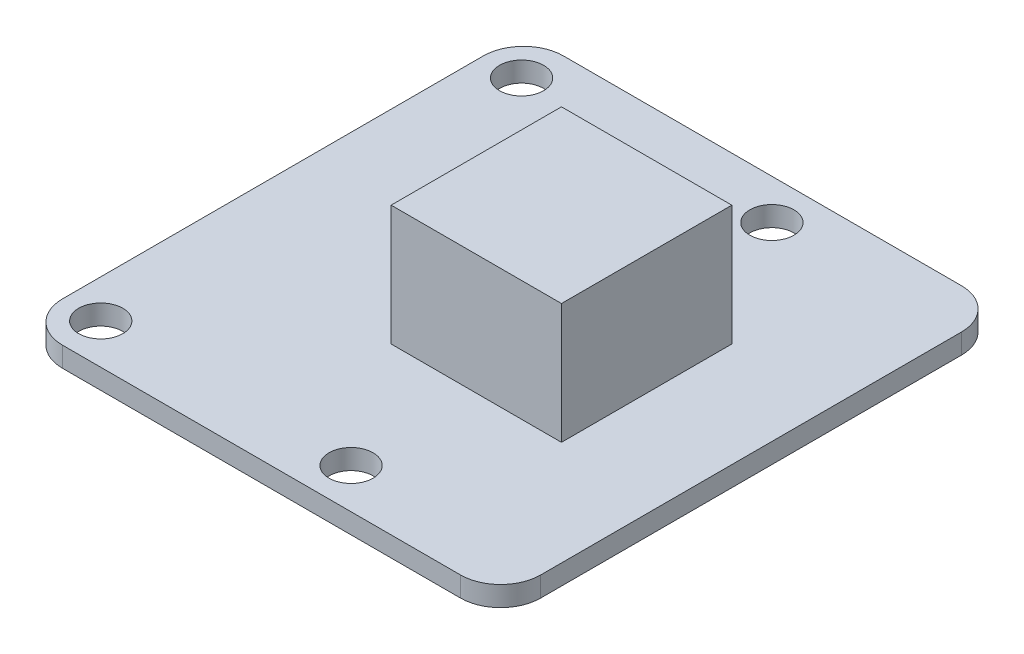
ISO-10303-21;
HEADER;
FILE_DESCRIPTION(('STEP AP214'),'2;1');
FILE_NAME('part.step','',(''),(''),'','','');
FILE_SCHEMA(('AUTOMOTIVE_DESIGN { 1 0 10303 214 1 1 1 1 }'));
ENDSEC;
DATA;
#1=APPLICATION_CONTEXT('core data for automotive mechanical design processes');
#2=APPLICATION_PROTOCOL_DEFINITION('international standard','automotive_design',2000,#1);
#3=PRODUCT_CONTEXT('',#1,'mechanical');
#4=PRODUCT('Part','Part','',(#3));
#5=PRODUCT_RELATED_PRODUCT_CATEGORY('part','',(#4));
#6=PRODUCT_DEFINITION_FORMATION('','',#4);
#7=PRODUCT_DEFINITION_CONTEXT('part definition',#1,'design');
#8=PRODUCT_DEFINITION('design','',#6,#7);
#9=PRODUCT_DEFINITION_SHAPE('','',#8);
#10=(LENGTH_UNIT() NAMED_UNIT(*) SI_UNIT(.MILLI.,.METRE.));
#11=(NAMED_UNIT(*) PLANE_ANGLE_UNIT() SI_UNIT($,.RADIAN.));
#12=(NAMED_UNIT(*) SI_UNIT($,.STERADIAN.) SOLID_ANGLE_UNIT());
#13=UNCERTAINTY_MEASURE_WITH_UNIT(LENGTH_MEASURE(1.E-05),#10,'distance_accuracy_value','');
#14=(GEOMETRIC_REPRESENTATION_CONTEXT(3) GLOBAL_UNCERTAINTY_ASSIGNED_CONTEXT((#13)) GLOBAL_UNIT_ASSIGNED_CONTEXT((#10,
#11,#12)) REPRESENTATION_CONTEXT('',''));
#15=CARTESIAN_POINT('',(0.,0.,0.));
#16=DIRECTION('',(0.,0.,1.));
#17=DIRECTION('',(1.,0.,0.));
#18=AXIS2_PLACEMENT_3D('',#15,#16,#17);
#19=CARTESIAN_POINT('',(0.,1.,0.));
#20=DIRECTION('',(0.,-1.,0.));
#21=DIRECTION('',(0.,0.,-1.));
#22=AXIS2_PLACEMENT_3D('',#19,#20,#21);
#23=PLANE('',#22);
#24=CARTESIAN_POINT('',(-10.02204,1.,10.5));
#25=DIRECTION('',(0.,1.,0.));
#26=DIRECTION('',(0.,0.,-1.));
#27=AXIS2_PLACEMENT_3D('',#24,#25,#26);
#28=CIRCLE('',#27,1.1);
#29=CARTESIAN_POINT('',(-10.02204,1.,9.4));
#30=VERTEX_POINT('',#29);
#31=EDGE_CURVE('E156',#30,#30,#28,.T.);
#32=ORIENTED_EDGE('',*,*,#31,.F.);
#33=EDGE_LOOP('',(#32));
#34=FACE_BOUND('',#33,.T.);
#35=CARTESIAN_POINT('',(2.469,1.,10.5));
#36=DIRECTION('',(0.,1.,0.));
#37=DIRECTION('',(0.,0.,-1.));
#38=AXIS2_PLACEMENT_3D('',#35,#36,#37);
#39=CIRCLE('',#38,1.1);
#40=CARTESIAN_POINT('',(2.469,1.,9.4));
#41=VERTEX_POINT('',#40);
#42=EDGE_CURVE('E166',#41,#41,#39,.T.);
#43=ORIENTED_EDGE('',*,*,#42,.F.);
#44=EDGE_LOOP('',(#43));
#45=FACE_BOUND('',#44,.T.);
#46=CARTESIAN_POINT('',(2.469,1.,-10.5));
#47=DIRECTION('',(0.,1.,0.));
#48=DIRECTION('',(0.,0.,1.));
#49=AXIS2_PLACEMENT_3D('',#46,#47,#48);
#50=CIRCLE('',#49,1.1);
#51=CARTESIAN_POINT('',(2.469,1.,-9.4));
#52=VERTEX_POINT('',#51);
#53=EDGE_CURVE('E174',#52,#52,#50,.T.);
#54=ORIENTED_EDGE('',*,*,#53,.F.);
#55=EDGE_LOOP('',(#54));
#56=FACE_BOUND('',#55,.T.);
#57=CARTESIAN_POINT('',(-10.02204,1.,-10.5));
#58=DIRECTION('',(0.,1.,0.));
#59=DIRECTION('',(0.,0.,1.));
#60=AXIS2_PLACEMENT_3D('',#57,#58,#59);
#61=CIRCLE('',#60,1.1);
#62=CARTESIAN_POINT('',(-10.02204,1.,-9.4));
#63=VERTEX_POINT('',#62);
#64=EDGE_CURVE('E182',#63,#63,#61,.T.);
#65=ORIENTED_EDGE('',*,*,#64,.F.);
#66=EDGE_LOOP('',(#65));
#67=FACE_BOUND('',#66,.T.);
#68=DIRECTION('',(-1.,0.,0.));
#69=VECTOR('',#68,1.);
#70=CARTESIAN_POINT('',(-11.931,1.,-12.5));
#71=LINE('',#70,#69);
#72=CARTESIAN_POINT('',(9.931,1.,-12.5));
#73=VERTEX_POINT('',#72);
#74=CARTESIAN_POINT('',(-9.931,1.,-12.5));
#75=VERTEX_POINT('',#74);
#76=EDGE_CURVE('E194',#73,#75,#71,.T.);
#77=ORIENTED_EDGE('',*,*,#76,.T.);
#78=CARTESIAN_POINT('',(-9.931,1.,-10.5));
#79=DIRECTION('',(0.,-1.,0.));
#80=DIRECTION('',(0.,0.,-1.));
#81=AXIS2_PLACEMENT_3D('',#78,#79,#80);
#82=CIRCLE('',#81,2.);
#83=CARTESIAN_POINT('',(-11.931,1.,-10.5));
#84=VERTEX_POINT('',#83);
#85=EDGE_CURVE('E256',#75,#84,#82,.F.);
#86=ORIENTED_EDGE('',*,*,#85,.T.);
#87=DIRECTION('',(0.,0.,1.));
#88=VECTOR('',#87,1.);
#89=CARTESIAN_POINT('',(-11.931,1.,12.5));
#90=LINE('',#89,#88);
#91=CARTESIAN_POINT('',(-11.931,1.,10.5));
#92=VERTEX_POINT('',#91);
#93=EDGE_CURVE('E199',#84,#92,#90,.T.);
#94=ORIENTED_EDGE('',*,*,#93,.T.);
#95=CARTESIAN_POINT('',(-9.931,1.,10.5));
#96=DIRECTION('',(0.,-1.,0.));
#97=DIRECTION('',(0.,0.,-1.));
#98=AXIS2_PLACEMENT_3D('',#95,#96,#97);
#99=CIRCLE('',#98,2.);
#100=CARTESIAN_POINT('',(-9.931,1.,12.5));
#101=VERTEX_POINT('',#100);
#102=EDGE_CURVE('E253',#92,#101,#99,.F.);
#103=ORIENTED_EDGE('',*,*,#102,.T.);
#104=DIRECTION('',(1.,0.,0.));
#105=VECTOR('',#104,1.);
#106=CARTESIAN_POINT('',(-11.931,1.,12.5));
#107=LINE('',#106,#105);
#108=CARTESIAN_POINT('',(9.931,1.,12.5));
#109=VERTEX_POINT('',#108);
#110=EDGE_CURVE('E203',#101,#109,#107,.T.);
#111=ORIENTED_EDGE('',*,*,#110,.T.);
#112=CARTESIAN_POINT('',(9.931,1.,10.5));
#113=DIRECTION('',(0.,-1.,0.));
#114=DIRECTION('',(0.,0.,-1.));
#115=AXIS2_PLACEMENT_3D('',#112,#113,#114);
#116=CIRCLE('',#115,2.);
#117=CARTESIAN_POINT('',(11.931,1.,10.5));
#118=VERTEX_POINT('',#117);
#119=EDGE_CURVE('E247',#109,#118,#116,.F.);
#120=ORIENTED_EDGE('',*,*,#119,.T.);
#121=DIRECTION('',(0.,0.,-1.));
#122=VECTOR('',#121,1.);
#123=CARTESIAN_POINT('',(11.931,1.,12.5));
#124=LINE('',#123,#122);
#125=CARTESIAN_POINT('',(11.931,1.,-10.5));
#126=VERTEX_POINT('',#125);
#127=EDGE_CURVE('E190',#118,#126,#124,.T.);
#128=ORIENTED_EDGE('',*,*,#127,.T.);
#129=CARTESIAN_POINT('',(9.931,1.,-10.5));
#130=DIRECTION('',(0.,-1.,0.));
#131=DIRECTION('',(0.,0.,-1.));
#132=AXIS2_PLACEMENT_3D('',#129,#130,#131);
#133=CIRCLE('',#132,2.);
#134=EDGE_CURVE('E250',#126,#73,#133,.F.);
#135=ORIENTED_EDGE('',*,*,#134,.T.);
#136=EDGE_LOOP('',(#77,#86,#94,#103,#111,#120,#128,#135));
#137=FACE_BOUND('',#136,.T.);
#138=DIRECTION('',(0.,0.,-1.));
#139=VECTOR('',#138,1.);
#140=CARTESIAN_POINT('',(6.719,1.,4.25));
#141=LINE('',#140,#139);
#142=CARTESIAN_POINT('',(6.719,1.,4.25));
#143=VERTEX_POINT('',#142);
#144=CARTESIAN_POINT('',(6.719,1.,-4.25));
#145=VERTEX_POINT('',#144);
#146=EDGE_CURVE('E55',#143,#145,#141,.T.);
#147=ORIENTED_EDGE('',*,*,#146,.F.);
#148=DIRECTION('',(1.,0.,0.));
#149=VECTOR('',#148,1.);
#150=CARTESIAN_POINT('',(-1.781,1.,4.25));
#151=LINE('',#150,#149);
#152=CARTESIAN_POINT('',(-1.781,1.,4.25));
#153=VERTEX_POINT('',#152);
#154=EDGE_CURVE('E59',#153,#143,#151,.T.);
#155=ORIENTED_EDGE('',*,*,#154,.F.);
#156=DIRECTION('',(0.,0.,1.));
#157=VECTOR('',#156,1.);
#158=CARTESIAN_POINT('',(-1.781,1.,4.25));
#159=LINE('',#158,#157);
#160=CARTESIAN_POINT('',(-1.781,1.,-4.25));
#161=VERTEX_POINT('',#160);
#162=EDGE_CURVE('E491',#161,#153,#159,.T.);
#163=ORIENTED_EDGE('',*,*,#162,.F.);
#164=DIRECTION('',(-1.,0.,0.));
#165=VECTOR('',#164,1.);
#166=CARTESIAN_POINT('',(-1.781,1.,-4.25));
#167=LINE('',#166,#165);
#168=EDGE_CURVE('E501',#145,#161,#167,.T.);
#169=ORIENTED_EDGE('',*,*,#168,.F.);
#170=EDGE_LOOP('',(#147,#155,#163,#169));
#171=FACE_BOUND('',#170,.T.);
#172=ADVANCED_FACE('F39',(#34,#45,#56,#67,#137,#171),#23,.F.);
#173=CARTESIAN_POINT('',(0.,0.,0.));
#174=DIRECTION('',(0.,-1.,0.));
#175=DIRECTION('',(0.,0.,-1.));
#176=AXIS2_PLACEMENT_3D('',#173,#174,#175);
#177=PLANE('',#176);
#178=CARTESIAN_POINT('',(2.469,0.,10.5));
#179=DIRECTION('',(0.,1.,0.));
#180=DIRECTION('',(0.,0.,-1.));
#181=AXIS2_PLACEMENT_3D('',#178,#179,#180);
#182=CIRCLE('',#181,1.1);
#183=CARTESIAN_POINT('',(2.469,0.,9.4));
#184=VERTEX_POINT('',#183);
#185=EDGE_CURVE('E164',#184,#184,#182,.T.);
#186=ORIENTED_EDGE('',*,*,#185,.T.);
#187=EDGE_LOOP('',(#186));
#188=FACE_BOUND('',#187,.T.);
#189=CARTESIAN_POINT('',(-10.02204,0.,-10.5));
#190=DIRECTION('',(0.,1.,0.));
#191=DIRECTION('',(0.,0.,1.));
#192=AXIS2_PLACEMENT_3D('',#189,#190,#191);
#193=CIRCLE('',#192,1.1);
#194=CARTESIAN_POINT('',(-10.02204,0.,-9.4));
#195=VERTEX_POINT('',#194);
#196=EDGE_CURVE('E178',#195,#195,#193,.T.);
#197=ORIENTED_EDGE('',*,*,#196,.T.);
#198=EDGE_LOOP('',(#197));
#199=FACE_BOUND('',#198,.T.);
#200=DIRECTION('',(0.,0.,1.));
#201=VECTOR('',#200,1.);
#202=CARTESIAN_POINT('',(-11.931,0.,12.5));
#203=LINE('',#202,#201);
#204=CARTESIAN_POINT('',(-11.931,0.,-10.5));
#205=VERTEX_POINT('',#204);
#206=CARTESIAN_POINT('',(-11.931,0.,10.5));
#207=VERTEX_POINT('',#206);
#208=EDGE_CURVE('E215',#205,#207,#203,.T.);
#209=ORIENTED_EDGE('',*,*,#208,.F.);
#210=CARTESIAN_POINT('',(-9.931,0.,-10.5));
#211=DIRECTION('',(0.,-1.,0.));
#212=DIRECTION('',(0.,0.,-1.));
#213=AXIS2_PLACEMENT_3D('',#210,#211,#212);
#214=CIRCLE('',#213,2.);
#215=CARTESIAN_POINT('',(-9.931,0.,-12.5));
#216=VERTEX_POINT('',#215);
#217=EDGE_CURVE('E237',#205,#216,#214,.T.);
#218=ORIENTED_EDGE('',*,*,#217,.T.);
#219=DIRECTION('',(-1.,0.,0.));
#220=VECTOR('',#219,1.);
#221=CARTESIAN_POINT('',(-11.931,0.,-12.5));
#222=LINE('',#221,#220);
#223=CARTESIAN_POINT('',(9.931,0.,-12.5));
#224=VERTEX_POINT('',#223);
#225=EDGE_CURVE('E211',#224,#216,#222,.T.);
#226=ORIENTED_EDGE('',*,*,#225,.F.);
#227=CARTESIAN_POINT('',(9.931,0.,-10.5));
#228=DIRECTION('',(0.,-1.,0.));
#229=DIRECTION('',(0.,0.,-1.));
#230=AXIS2_PLACEMENT_3D('',#227,#228,#229);
#231=CIRCLE('',#230,2.);
#232=CARTESIAN_POINT('',(11.931,0.,-10.5));
#233=VERTEX_POINT('',#232);
#234=EDGE_CURVE('E231',#224,#233,#231,.T.);
#235=ORIENTED_EDGE('',*,*,#234,.T.);
#236=DIRECTION('',(0.,0.,-1.));
#237=VECTOR('',#236,1.);
#238=CARTESIAN_POINT('',(11.931,0.,12.5));
#239=LINE('',#238,#237);
#240=CARTESIAN_POINT('',(11.931,0.,10.5));
#241=VERTEX_POINT('',#240);
#242=EDGE_CURVE('E186',#241,#233,#239,.T.);
#243=ORIENTED_EDGE('',*,*,#242,.F.);
#244=CARTESIAN_POINT('',(9.931,0.,10.5));
#245=DIRECTION('',(0.,-1.,0.));
#246=DIRECTION('',(0.,0.,-1.));
#247=AXIS2_PLACEMENT_3D('',#244,#245,#246);
#248=CIRCLE('',#247,2.);
#249=CARTESIAN_POINT('',(9.931,0.,12.5));
#250=VERTEX_POINT('',#249);
#251=EDGE_CURVE('E228',#241,#250,#248,.T.);
#252=ORIENTED_EDGE('',*,*,#251,.T.);
#253=DIRECTION('',(1.,0.,0.));
#254=VECTOR('',#253,1.);
#255=CARTESIAN_POINT('',(-11.931,0.,12.5));
#256=LINE('',#255,#254);
#257=CARTESIAN_POINT('',(-9.931,0.,12.5));
#258=VERTEX_POINT('',#257);
#259=EDGE_CURVE('E195',#258,#250,#256,.T.);
#260=ORIENTED_EDGE('',*,*,#259,.F.);
#261=CARTESIAN_POINT('',(-9.931,0.,10.5));
#262=DIRECTION('',(0.,-1.,0.));
#263=DIRECTION('',(0.,0.,-1.));
#264=AXIS2_PLACEMENT_3D('',#261,#262,#263);
#265=CIRCLE('',#264,2.);
#266=EDGE_CURVE('E234',#258,#207,#265,.T.);
#267=ORIENTED_EDGE('',*,*,#266,.T.);
#268=EDGE_LOOP('',(#209,#218,#226,#235,#243,#252,#260,#267));
#269=FACE_BOUND('',#268,.T.);
#270=CARTESIAN_POINT('',(2.469,0.,-10.5));
#271=DIRECTION('',(0.,1.,0.));
#272=DIRECTION('',(0.,0.,1.));
#273=AXIS2_PLACEMENT_3D('',#270,#271,#272);
#274=CIRCLE('',#273,1.1);
#275=CARTESIAN_POINT('',(2.469,0.,-9.4));
#276=VERTEX_POINT('',#275);
#277=EDGE_CURVE('E170',#276,#276,#274,.T.);
#278=ORIENTED_EDGE('',*,*,#277,.T.);
#279=EDGE_LOOP('',(#278));
#280=FACE_BOUND('',#279,.T.);
#281=CARTESIAN_POINT('',(-10.02204,0.,10.5));
#282=DIRECTION('',(0.,1.,0.));
#283=DIRECTION('',(0.,0.,-1.));
#284=AXIS2_PLACEMENT_3D('',#281,#282,#283);
#285=CIRCLE('',#284,1.1);
#286=CARTESIAN_POINT('',(-10.02204,0.,9.4));
#287=VERTEX_POINT('',#286);
#288=EDGE_CURVE('E151',#287,#287,#285,.T.);
#289=ORIENTED_EDGE('',*,*,#288,.T.);
#290=EDGE_LOOP('',(#289));
#291=FACE_BOUND('',#290,.T.);
#292=ADVANCED_FACE('F277',(#188,#199,#269,#280,#291),#177,.T.);
#293=CARTESIAN_POINT('',(11.931,1.,12.5));
#294=DIRECTION('',(-1.,0.,0.));
#295=DIRECTION('',(0.,0.,1.));
#296=AXIS2_PLACEMENT_3D('',#293,#294,#295);
#297=PLANE('',#296);
#298=ORIENTED_EDGE('',*,*,#242,.T.);
#299=DIRECTION('',(0.,-1.,0.));
#300=VECTOR('',#299,1.);
#301=CARTESIAN_POINT('',(11.931,1.,-10.5));
#302=LINE('',#301,#300);
#303=EDGE_CURVE('E11',#233,#126,#302,.F.);
#304=ORIENTED_EDGE('',*,*,#303,.T.);
#305=ORIENTED_EDGE('',*,*,#127,.F.);
#306=DIRECTION('',(0.,-1.,0.));
#307=VECTOR('',#306,1.);
#308=CARTESIAN_POINT('',(11.931,1.,10.5));
#309=LINE('',#308,#307);
#310=EDGE_CURVE('E48',#118,#241,#309,.T.);
#311=ORIENTED_EDGE('',*,*,#310,.T.);
#312=EDGE_LOOP('',(#298,#304,#305,#311));
#313=FACE_BOUND('',#312,.T.);
#314=ADVANCED_FACE('F271',(#313),#297,.F.);
#315=CARTESIAN_POINT('',(-11.931,1.,-12.5));
#316=DIRECTION('',(0.,0.,1.));
#317=DIRECTION('',(1.,0.,0.));
#318=AXIS2_PLACEMENT_3D('',#315,#316,#317);
#319=PLANE('',#318);
#320=ORIENTED_EDGE('',*,*,#225,.T.);
#321=DIRECTION('',(0.,-1.,0.));
#322=VECTOR('',#321,1.);
#323=CARTESIAN_POINT('',(-9.931,1.,-12.5));
#324=LINE('',#323,#322);
#325=EDGE_CURVE('E244',#216,#75,#324,.F.);
#326=ORIENTED_EDGE('',*,*,#325,.T.);
#327=ORIENTED_EDGE('',*,*,#76,.F.);
#328=DIRECTION('',(0.,-1.,0.));
#329=VECTOR('',#328,1.);
#330=CARTESIAN_POINT('',(9.931,1.,-12.5));
#331=LINE('',#330,#329);
#332=EDGE_CURVE('E240',#73,#224,#331,.T.);
#333=ORIENTED_EDGE('',*,*,#332,.T.);
#334=EDGE_LOOP('',(#320,#326,#327,#333));
#335=FACE_BOUND('',#334,.T.);
#336=ADVANCED_FACE('F287',(#335),#319,.F.);
#337=CARTESIAN_POINT('',(-11.931,1.,12.5));
#338=DIRECTION('',(1.,0.,0.));
#339=DIRECTION('',(0.,0.,-1.));
#340=AXIS2_PLACEMENT_3D('',#337,#338,#339);
#341=PLANE('',#340);
#342=ORIENTED_EDGE('',*,*,#93,.F.);
#343=DIRECTION('',(0.,-1.,0.));
#344=VECTOR('',#343,1.);
#345=CARTESIAN_POINT('',(-11.931,1.,-10.5));
#346=LINE('',#345,#344);
#347=EDGE_CURVE('E224',#84,#205,#346,.T.);
#348=ORIENTED_EDGE('',*,*,#347,.T.);
#349=ORIENTED_EDGE('',*,*,#208,.T.);
#350=DIRECTION('',(0.,-1.,0.));
#351=VECTOR('',#350,1.);
#352=CARTESIAN_POINT('',(-11.931,1.,10.5));
#353=LINE('',#352,#351);
#354=EDGE_CURVE('E207',#207,#92,#353,.F.);
#355=ORIENTED_EDGE('',*,*,#354,.T.);
#356=EDGE_LOOP('',(#342,#348,#349,#355));
#357=FACE_BOUND('',#356,.T.);
#358=ADVANCED_FACE('F296',(#357),#341,.F.);
#359=CARTESIAN_POINT('',(-11.931,1.,12.5));
#360=DIRECTION('',(0.,0.,-1.));
#361=DIRECTION('',(-1.,0.,0.));
#362=AXIS2_PLACEMENT_3D('',#359,#360,#361);
#363=PLANE('',#362);
#364=ORIENTED_EDGE('',*,*,#110,.F.);
#365=DIRECTION('',(0.,-1.,0.));
#366=VECTOR('',#365,1.);
#367=CARTESIAN_POINT('',(-9.931,1.,12.5));
#368=LINE('',#367,#366);
#369=EDGE_CURVE('E262',#101,#258,#368,.T.);
#370=ORIENTED_EDGE('',*,*,#369,.T.);
#371=ORIENTED_EDGE('',*,*,#259,.T.);
#372=DIRECTION('',(0.,-1.,0.));
#373=VECTOR('',#372,1.);
#374=CARTESIAN_POINT('',(9.931,1.,12.5));
#375=LINE('',#374,#373);
#376=EDGE_CURVE('E259',#250,#109,#375,.F.);
#377=ORIENTED_EDGE('',*,*,#376,.T.);
#378=EDGE_LOOP('',(#364,#370,#371,#377));
#379=FACE_BOUND('',#378,.T.);
#380=ADVANCED_FACE('F304',(#379),#363,.F.);
#381=CARTESIAN_POINT('',(-10.02204,1.,-10.5));
#382=DIRECTION('',(0.,-1.,0.));
#383=DIRECTION('',(0.,0.,-1.));
#384=AXIS2_PLACEMENT_3D('',#381,#382,#383);
#385=CYLINDRICAL_SURFACE('',#384,1.1);
#386=ORIENTED_EDGE('',*,*,#64,.T.);
#387=EDGE_LOOP('',(#386));
#388=FACE_BOUND('',#387,.T.);
#389=ORIENTED_EDGE('',*,*,#196,.F.);
#390=EDGE_LOOP('',(#389));
#391=FACE_BOUND('',#390,.T.);
#392=ADVANCED_FACE('F323',(#388,#391),#385,.F.);
#393=CARTESIAN_POINT('',(2.469,1.,-10.5));
#394=DIRECTION('',(0.,-1.,0.));
#395=DIRECTION('',(0.,0.,-1.));
#396=AXIS2_PLACEMENT_3D('',#393,#394,#395);
#397=CYLINDRICAL_SURFACE('',#396,1.1);
#398=ORIENTED_EDGE('',*,*,#53,.T.);
#399=EDGE_LOOP('',(#398));
#400=FACE_BOUND('',#399,.T.);
#401=ORIENTED_EDGE('',*,*,#277,.F.);
#402=EDGE_LOOP('',(#401));
#403=FACE_BOUND('',#402,.T.);
#404=ADVANCED_FACE('F406',(#400,#403),#397,.F.);
#405=CARTESIAN_POINT('',(2.469,1.,10.5));
#406=DIRECTION('',(0.,-1.,0.));
#407=DIRECTION('',(0.,0.,-1.));
#408=AXIS2_PLACEMENT_3D('',#405,#406,#407);
#409=CYLINDRICAL_SURFACE('',#408,1.1);
#410=ORIENTED_EDGE('',*,*,#42,.T.);
#411=EDGE_LOOP('',(#410));
#412=FACE_BOUND('',#411,.T.);
#413=ORIENTED_EDGE('',*,*,#185,.F.);
#414=EDGE_LOOP('',(#413));
#415=FACE_BOUND('',#414,.T.);
#416=ADVANCED_FACE('F403',(#412,#415),#409,.F.);
#417=CARTESIAN_POINT('',(-10.02204,1.,10.5));
#418=DIRECTION('',(0.,-1.,0.));
#419=DIRECTION('',(0.,0.,-1.));
#420=AXIS2_PLACEMENT_3D('',#417,#418,#419);
#421=CYLINDRICAL_SURFACE('',#420,1.1);
#422=ORIENTED_EDGE('',*,*,#31,.T.);
#423=EDGE_LOOP('',(#422));
#424=FACE_BOUND('',#423,.T.);
#425=ORIENTED_EDGE('',*,*,#288,.F.);
#426=EDGE_LOOP('',(#425));
#427=FACE_BOUND('',#426,.T.);
#428=ADVANCED_FACE('F336',(#424,#427),#421,.F.);
#429=CARTESIAN_POINT('',(-9.931,1.,-10.5));
#430=DIRECTION('',(0.,-1.,0.));
#431=DIRECTION('',(0.,0.,-1.));
#432=AXIS2_PLACEMENT_3D('',#429,#430,#431);
#433=CYLINDRICAL_SURFACE('',#432,2.);
#434=ORIENTED_EDGE('',*,*,#85,.F.);
#435=ORIENTED_EDGE('',*,*,#325,.F.);
#436=ORIENTED_EDGE('',*,*,#217,.F.);
#437=ORIENTED_EDGE('',*,*,#347,.F.);
#438=EDGE_LOOP('',(#434,#435,#436,#437));
#439=FACE_BOUND('',#438,.T.);
#440=ADVANCED_FACE('F294',(#439),#433,.T.);
#441=CARTESIAN_POINT('',(-9.931,1.,10.5));
#442=DIRECTION('',(0.,-1.,0.));
#443=DIRECTION('',(0.,0.,-1.));
#444=AXIS2_PLACEMENT_3D('',#441,#442,#443);
#445=CYLINDRICAL_SURFACE('',#444,2.);
#446=ORIENTED_EDGE('',*,*,#102,.F.);
#447=ORIENTED_EDGE('',*,*,#354,.F.);
#448=ORIENTED_EDGE('',*,*,#266,.F.);
#449=ORIENTED_EDGE('',*,*,#369,.F.);
#450=EDGE_LOOP('',(#446,#447,#448,#449));
#451=FACE_BOUND('',#450,.T.);
#452=ADVANCED_FACE('F301',(#451),#445,.T.);
#453=CARTESIAN_POINT('',(9.931,1.,-10.5));
#454=DIRECTION('',(0.,-1.,0.));
#455=DIRECTION('',(0.,0.,-1.));
#456=AXIS2_PLACEMENT_3D('',#453,#454,#455);
#457=CYLINDRICAL_SURFACE('',#456,2.);
#458=ORIENTED_EDGE('',*,*,#134,.F.);
#459=ORIENTED_EDGE('',*,*,#303,.F.);
#460=ORIENTED_EDGE('',*,*,#234,.F.);
#461=ORIENTED_EDGE('',*,*,#332,.F.);
#462=EDGE_LOOP('',(#458,#459,#460,#461));
#463=FACE_BOUND('',#462,.T.);
#464=ADVANCED_FACE('F284',(#463),#457,.T.);
#465=CARTESIAN_POINT('',(9.931,1.,10.5));
#466=DIRECTION('',(0.,-1.,0.));
#467=DIRECTION('',(0.,0.,-1.));
#468=AXIS2_PLACEMENT_3D('',#465,#466,#467);
#469=CYLINDRICAL_SURFACE('',#468,2.);
#470=ORIENTED_EDGE('',*,*,#119,.F.);
#471=ORIENTED_EDGE('',*,*,#376,.F.);
#472=ORIENTED_EDGE('',*,*,#251,.F.);
#473=ORIENTED_EDGE('',*,*,#310,.F.);
#474=EDGE_LOOP('',(#470,#471,#472,#473));
#475=FACE_BOUND('',#474,.T.);
#476=ADVANCED_FACE('F41',(#475),#469,.T.);
#477=CARTESIAN_POINT('',(6.719,7.,4.25));
#478=DIRECTION('',(-1.,0.,0.));
#479=DIRECTION('',(0.,0.,1.));
#480=AXIS2_PLACEMENT_3D('',#477,#478,#479);
#481=PLANE('',#480);
#482=ORIENTED_EDGE('',*,*,#146,.T.);
#483=DIRECTION('',(0.,-1.,0.));
#484=VECTOR('',#483,1.);
#485=CARTESIAN_POINT('',(6.719,7.,-4.25));
#486=LINE('',#485,#484);
#487=CARTESIAN_POINT('',(6.719,7.,-4.25));
#488=VERTEX_POINT('',#487);
#489=EDGE_CURVE('E131',#488,#145,#486,.T.);
#490=ORIENTED_EDGE('',*,*,#489,.F.);
#491=DIRECTION('',(0.,0.,-1.));
#492=VECTOR('',#491,1.);
#493=CARTESIAN_POINT('',(6.719,7.,4.25));
#494=LINE('',#493,#492);
#495=CARTESIAN_POINT('',(6.719,7.,4.25));
#496=VERTEX_POINT('',#495);
#497=EDGE_CURVE('E138',#496,#488,#494,.T.);
#498=ORIENTED_EDGE('',*,*,#497,.F.);
#499=DIRECTION('',(0.,-1.,0.));
#500=VECTOR('',#499,1.);
#501=CARTESIAN_POINT('',(6.719,7.,4.25));
#502=LINE('',#501,#500);
#503=EDGE_CURVE('E488',#496,#143,#502,.T.);
#504=ORIENTED_EDGE('',*,*,#503,.T.);
#505=EDGE_LOOP('',(#482,#490,#498,#504));
#506=FACE_BOUND('',#505,.T.);
#507=ADVANCED_FACE('F149',(#506),#481,.F.);
#508=CARTESIAN_POINT('',(-1.781,7.,-4.25));
#509=DIRECTION('',(0.,0.,1.));
#510=DIRECTION('',(1.,0.,0.));
#511=AXIS2_PLACEMENT_3D('',#508,#509,#510);
#512=PLANE('',#511);
#513=ORIENTED_EDGE('',*,*,#168,.T.);
#514=DIRECTION('',(0.,-1.,0.));
#515=VECTOR('',#514,1.);
#516=CARTESIAN_POINT('',(-1.781,7.,-4.25));
#517=LINE('',#516,#515);
#518=CARTESIAN_POINT('',(-1.781,7.,-4.25));
#519=VERTEX_POINT('',#518);
#520=EDGE_CURVE('E133',#519,#161,#517,.T.);
#521=ORIENTED_EDGE('',*,*,#520,.F.);
#522=DIRECTION('',(-1.,0.,0.));
#523=VECTOR('',#522,1.);
#524=CARTESIAN_POINT('',(-1.781,7.,-4.25));
#525=LINE('',#524,#523);
#526=EDGE_CURVE('E126',#488,#519,#525,.T.);
#527=ORIENTED_EDGE('',*,*,#526,.F.);
#528=ORIENTED_EDGE('',*,*,#489,.T.);
#529=EDGE_LOOP('',(#513,#521,#527,#528));
#530=FACE_BOUND('',#529,.T.);
#531=ADVANCED_FACE('F129',(#530),#512,.F.);
#532=CARTESIAN_POINT('',(-1.781,7.,4.25));
#533=DIRECTION('',(1.,0.,0.));
#534=DIRECTION('',(0.,0.,-1.));
#535=AXIS2_PLACEMENT_3D('',#532,#533,#534);
#536=PLANE('',#535);
#537=ORIENTED_EDGE('',*,*,#162,.T.);
#538=DIRECTION('',(0.,-1.,0.));
#539=VECTOR('',#538,1.);
#540=CARTESIAN_POINT('',(-1.781,7.,4.25));
#541=LINE('',#540,#539);
#542=CARTESIAN_POINT('',(-1.781,7.,4.25));
#543=VERTEX_POINT('',#542);
#544=EDGE_CURVE('E158',#543,#153,#541,.T.);
#545=ORIENTED_EDGE('',*,*,#544,.F.);
#546=DIRECTION('',(0.,0.,1.));
#547=VECTOR('',#546,1.);
#548=CARTESIAN_POINT('',(-1.781,7.,4.25));
#549=LINE('',#548,#547);
#550=EDGE_CURVE('E137',#519,#543,#549,.T.);
#551=ORIENTED_EDGE('',*,*,#550,.F.);
#552=ORIENTED_EDGE('',*,*,#520,.T.);
#553=EDGE_LOOP('',(#537,#545,#551,#552));
#554=FACE_BOUND('',#553,.T.);
#555=ADVANCED_FACE('F370',(#554),#536,.F.);
#556=CARTESIAN_POINT('',(-1.781,7.,4.25));
#557=DIRECTION('',(0.,0.,-1.));
#558=DIRECTION('',(-1.,0.,0.));
#559=AXIS2_PLACEMENT_3D('',#556,#557,#558);
#560=PLANE('',#559);
#561=ORIENTED_EDGE('',*,*,#154,.T.);
#562=ORIENTED_EDGE('',*,*,#503,.F.);
#563=DIRECTION('',(1.,0.,0.));
#564=VECTOR('',#563,1.);
#565=CARTESIAN_POINT('',(-1.781,7.,4.25));
#566=LINE('',#565,#564);
#567=EDGE_CURVE('E143',#543,#496,#566,.T.);
#568=ORIENTED_EDGE('',*,*,#567,.F.);
#569=ORIENTED_EDGE('',*,*,#544,.T.);
#570=EDGE_LOOP('',(#561,#562,#568,#569));
#571=FACE_BOUND('',#570,.T.);
#572=ADVANCED_FACE('F379',(#571),#560,.F.);
#573=CARTESIAN_POINT('',(0.,7.,0.));
#574=DIRECTION('',(0.,-1.,0.));
#575=DIRECTION('',(0.,0.,-1.));
#576=AXIS2_PLACEMENT_3D('',#573,#574,#575);
#577=PLANE('',#576);
#578=ORIENTED_EDGE('',*,*,#497,.T.);
#579=ORIENTED_EDGE('',*,*,#526,.T.);
#580=ORIENTED_EDGE('',*,*,#550,.T.);
#581=ORIENTED_EDGE('',*,*,#567,.T.);
#582=EDGE_LOOP('',(#578,#579,#580,#581));
#583=FACE_BOUND('',#582,.T.);
#584=ADVANCED_FACE('F141',(#583),#577,.F.);
#585=CLOSED_SHELL('',(#172,#292,#314,#336,#358,#380,#392,#404,#416,#428,#440,#452,#464,#476,
#507,#531,#555,#572,#584));
#586=MANIFOLD_SOLID_BREP('B2',#585);
#587=ADVANCED_BREP_SHAPE_REPRESENTATION('',(#18,#586),#14);
#588=SHAPE_DEFINITION_REPRESENTATION(#9,#587);
ENDSEC;
END-ISO-10303-21;
